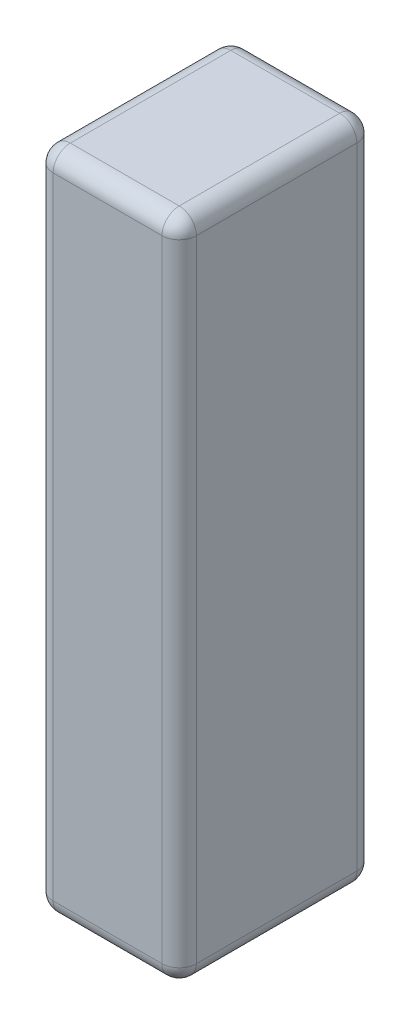
ISO-10303-21;
HEADER;
FILE_DESCRIPTION(('STEP AP214'),'2;1');
FILE_NAME('part.step','',(''),(''),'','','');
FILE_SCHEMA(('AUTOMOTIVE_DESIGN { 1 0 10303 214 1 1 1 1 }'));
ENDSEC;
DATA;
#1=APPLICATION_CONTEXT('core data for automotive mechanical design processes');
#2=APPLICATION_PROTOCOL_DEFINITION('international standard','automotive_design',2000,#1);
#3=PRODUCT_CONTEXT('',#1,'mechanical');
#4=PRODUCT('Part','Part','',(#3));
#5=PRODUCT_RELATED_PRODUCT_CATEGORY('part','',(#4));
#6=PRODUCT_DEFINITION_FORMATION('','',#4);
#7=PRODUCT_DEFINITION_CONTEXT('part definition',#1,'design');
#8=PRODUCT_DEFINITION('design','',#6,#7);
#9=PRODUCT_DEFINITION_SHAPE('','',#8);
#10=(LENGTH_UNIT() NAMED_UNIT(*) SI_UNIT(.MILLI.,.METRE.));
#11=(NAMED_UNIT(*) PLANE_ANGLE_UNIT() SI_UNIT($,.RADIAN.));
#12=(NAMED_UNIT(*) SI_UNIT($,.STERADIAN.) SOLID_ANGLE_UNIT());
#13=UNCERTAINTY_MEASURE_WITH_UNIT(LENGTH_MEASURE(1.E-05),#10,'distance_accuracy_value','');
#14=(GEOMETRIC_REPRESENTATION_CONTEXT(3) GLOBAL_UNCERTAINTY_ASSIGNED_CONTEXT((#13)) GLOBAL_UNIT_ASSIGNED_CONTEXT((#10,
#11,#12)) REPRESENTATION_CONTEXT('',''));
#15=CARTESIAN_POINT('',(0.,0.,0.));
#16=DIRECTION('',(0.,0.,1.));
#17=DIRECTION('',(1.,0.,0.));
#18=AXIS2_PLACEMENT_3D('',#15,#16,#17);
#19=CARTESIAN_POINT('',(-12.5,116.,-17.));
#20=DIRECTION('',(1.,0.,0.));
#21=DIRECTION('',(0.,0.,-1.));
#22=AXIS2_PLACEMENT_3D('',#19,#20,#21);
#23=PLANE('',#22);
#24=DIRECTION('',(0.,-1.,0.));
#25=VECTOR('',#24,1.);
#26=CARTESIAN_POINT('',(-12.5,116.,-14.));
#27=LINE('',#26,#25);
#28=CARTESIAN_POINT('',(-12.5,113.,-14.));
#29=VERTEX_POINT('',#28);
#30=CARTESIAN_POINT('',(-12.5,3.,-14.));
#31=VERTEX_POINT('',#30);
#32=EDGE_CURVE('E132',#29,#31,#27,.T.);
#33=ORIENTED_EDGE('',*,*,#32,.T.);
#34=DIRECTION('',(0.,0.,1.));
#35=VECTOR('',#34,1.);
#36=CARTESIAN_POINT('',(-12.5,3.,17.));
#37=LINE('',#36,#35);
#38=CARTESIAN_POINT('',(-12.5,3.,14.));
#39=VERTEX_POINT('',#38);
#40=EDGE_CURVE('E128',#31,#39,#37,.T.);
#41=ORIENTED_EDGE('',*,*,#40,.T.);
#42=DIRECTION('',(0.,-1.,0.));
#43=VECTOR('',#42,1.);
#44=CARTESIAN_POINT('',(-12.5,116.,14.));
#45=LINE('',#44,#43);
#46=CARTESIAN_POINT('',(-12.5,113.,14.));
#47=VERTEX_POINT('',#46);
#48=EDGE_CURVE('E121',#39,#47,#45,.F.);
#49=ORIENTED_EDGE('',*,*,#48,.T.);
#50=DIRECTION('',(0.,0.,1.));
#51=VECTOR('',#50,1.);
#52=CARTESIAN_POINT('',(-12.5,113.,-17.));
#53=LINE('',#52,#51);
#54=EDGE_CURVE('E125',#47,#29,#53,.F.);
#55=ORIENTED_EDGE('',*,*,#54,.T.);
#56=EDGE_LOOP('',(#33,#41,#49,#55));
#57=FACE_BOUND('',#56,.T.);
#58=ADVANCED_FACE('F33',(#57),#23,.F.);
#59=CARTESIAN_POINT('',(12.5,116.,17.));
#60=DIRECTION('',(0.,0.,-1.));
#61=DIRECTION('',(-1.,0.,0.));
#62=AXIS2_PLACEMENT_3D('',#59,#60,#61);
#63=PLANE('',#62);
#64=DIRECTION('',(0.,-1.,0.));
#65=VECTOR('',#64,1.);
#66=CARTESIAN_POINT('',(-9.5,116.,17.));
#67=LINE('',#66,#65);
#68=CARTESIAN_POINT('',(-9.5,113.,17.));
#69=VERTEX_POINT('',#68);
#70=CARTESIAN_POINT('',(-9.5,3.,17.));
#71=VERTEX_POINT('',#70);
#72=EDGE_CURVE('E140',#69,#71,#67,.T.);
#73=ORIENTED_EDGE('',*,*,#72,.T.);
#74=DIRECTION('',(1.,0.,0.));
#75=VECTOR('',#74,1.);
#76=CARTESIAN_POINT('',(12.5,3.,17.));
#77=LINE('',#76,#75);
#78=CARTESIAN_POINT('',(9.5,3.,17.));
#79=VERTEX_POINT('',#78);
#80=EDGE_CURVE('E178',#71,#79,#77,.T.);
#81=ORIENTED_EDGE('',*,*,#80,.T.);
#82=DIRECTION('',(0.,-1.,0.));
#83=VECTOR('',#82,1.);
#84=CARTESIAN_POINT('',(9.5,116.,17.));
#85=LINE('',#84,#83);
#86=CARTESIAN_POINT('',(9.5,113.,17.));
#87=VERTEX_POINT('',#86);
#88=EDGE_CURVE('E175',#79,#87,#85,.F.);
#89=ORIENTED_EDGE('',*,*,#88,.T.);
#90=DIRECTION('',(1.,0.,0.));
#91=VECTOR('',#90,1.);
#92=CARTESIAN_POINT('',(12.5,113.,17.));
#93=LINE('',#92,#91);
#94=EDGE_CURVE('E173',#87,#69,#93,.F.);
#95=ORIENTED_EDGE('',*,*,#94,.T.);
#96=EDGE_LOOP('',(#73,#81,#89,#95));
#97=FACE_BOUND('',#96,.T.);
#98=ADVANCED_FACE('F295',(#97),#63,.F.);
#99=CARTESIAN_POINT('',(12.5,116.,-17.));
#100=DIRECTION('',(-1.,0.,0.));
#101=DIRECTION('',(0.,0.,1.));
#102=AXIS2_PLACEMENT_3D('',#99,#100,#101);
#103=PLANE('',#102);
#104=DIRECTION('',(0.,-1.,0.));
#105=VECTOR('',#104,1.);
#106=CARTESIAN_POINT('',(12.5,116.,14.));
#107=LINE('',#106,#105);
#108=CARTESIAN_POINT('',(12.5,113.,14.));
#109=VERTEX_POINT('',#108);
#110=CARTESIAN_POINT('',(12.5,3.,14.));
#111=VERTEX_POINT('',#110);
#112=EDGE_CURVE('E184',#109,#111,#107,.T.);
#113=ORIENTED_EDGE('',*,*,#112,.T.);
#114=DIRECTION('',(0.,0.,-1.));
#115=VECTOR('',#114,1.);
#116=CARTESIAN_POINT('',(12.5,3.,-17.));
#117=LINE('',#116,#115);
#118=CARTESIAN_POINT('',(12.5,3.,-14.));
#119=VERTEX_POINT('',#118);
#120=EDGE_CURVE('E187',#111,#119,#117,.T.);
#121=ORIENTED_EDGE('',*,*,#120,.T.);
#122=DIRECTION('',(0.,-1.,0.));
#123=VECTOR('',#122,1.);
#124=CARTESIAN_POINT('',(12.5,116.,-14.));
#125=LINE('',#124,#123);
#126=CARTESIAN_POINT('',(12.5,113.,-14.));
#127=VERTEX_POINT('',#126);
#128=EDGE_CURVE('E182',#119,#127,#125,.F.);
#129=ORIENTED_EDGE('',*,*,#128,.T.);
#130=DIRECTION('',(0.,0.,-1.));
#131=VECTOR('',#130,1.);
#132=CARTESIAN_POINT('',(12.5,113.,-17.));
#133=LINE('',#132,#131);
#134=EDGE_CURVE('E180',#127,#109,#133,.F.);
#135=ORIENTED_EDGE('',*,*,#134,.T.);
#136=EDGE_LOOP('',(#113,#121,#129,#135));
#137=FACE_BOUND('',#136,.T.);
#138=ADVANCED_FACE('F272',(#137),#103,.F.);
#139=CARTESIAN_POINT('',(12.5,116.,-17.));
#140=DIRECTION('',(0.,0.,1.));
#141=DIRECTION('',(1.,0.,0.));
#142=AXIS2_PLACEMENT_3D('',#139,#140,#141);
#143=PLANE('',#142);
#144=DIRECTION('',(0.,-1.,0.));
#145=VECTOR('',#144,1.);
#146=CARTESIAN_POINT('',(9.5,116.,-17.));
#147=LINE('',#146,#145);
#148=CARTESIAN_POINT('',(9.5,113.,-17.));
#149=VERTEX_POINT('',#148);
#150=CARTESIAN_POINT('',(9.5,3.,-17.));
#151=VERTEX_POINT('',#150);
#152=EDGE_CURVE('E166',#149,#151,#147,.T.);
#153=ORIENTED_EDGE('',*,*,#152,.T.);
#154=DIRECTION('',(-1.,0.,0.));
#155=VECTOR('',#154,1.);
#156=CARTESIAN_POINT('',(-12.5,3.,-17.));
#157=LINE('',#156,#155);
#158=CARTESIAN_POINT('',(-9.5,3.,-17.));
#159=VERTEX_POINT('',#158);
#160=EDGE_CURVE('E171',#151,#159,#157,.T.);
#161=ORIENTED_EDGE('',*,*,#160,.T.);
#162=DIRECTION('',(0.,-1.,0.));
#163=VECTOR('',#162,1.);
#164=CARTESIAN_POINT('',(-9.5,116.,-17.));
#165=LINE('',#164,#163);
#166=CARTESIAN_POINT('',(-9.5,113.,-17.));
#167=VERTEX_POINT('',#166);
#168=EDGE_CURVE('E168',#159,#167,#165,.F.);
#169=ORIENTED_EDGE('',*,*,#168,.T.);
#170=DIRECTION('',(-1.,0.,0.));
#171=VECTOR('',#170,1.);
#172=CARTESIAN_POINT('',(12.5,113.,-17.));
#173=LINE('',#172,#171);
#174=EDGE_CURVE('E164',#167,#149,#173,.F.);
#175=ORIENTED_EDGE('',*,*,#174,.T.);
#176=EDGE_LOOP('',(#153,#161,#169,#175));
#177=FACE_BOUND('',#176,.T.);
#178=ADVANCED_FACE('F302',(#177),#143,.F.);
#179=CARTESIAN_POINT('',(0.,116.,0.));
#180=DIRECTION('',(0.,-1.,0.));
#181=DIRECTION('',(0.,0.,-1.));
#182=AXIS2_PLACEMENT_3D('',#179,#180,#181);
#183=PLANE('',#182);
#184=DIRECTION('',(0.,0.,-1.));
#185=VECTOR('',#184,1.);
#186=CARTESIAN_POINT('',(9.5,116.,0.));
#187=LINE('',#186,#185);
#188=CARTESIAN_POINT('',(9.5,116.,14.));
#189=VERTEX_POINT('',#188);
#190=CARTESIAN_POINT('',(9.5,116.,-14.));
#191=VERTEX_POINT('',#190);
#192=EDGE_CURVE('E42',#189,#191,#187,.T.);
#193=ORIENTED_EDGE('',*,*,#192,.T.);
#194=DIRECTION('',(-1.,0.,0.));
#195=VECTOR('',#194,1.);
#196=CARTESIAN_POINT('',(0.,116.,-14.));
#197=LINE('',#196,#195);
#198=CARTESIAN_POINT('',(-9.5,116.,-14.));
#199=VERTEX_POINT('',#198);
#200=EDGE_CURVE('E11',#191,#199,#197,.T.);
#201=ORIENTED_EDGE('',*,*,#200,.T.);
#202=DIRECTION('',(0.,0.,1.));
#203=VECTOR('',#202,1.);
#204=CARTESIAN_POINT('',(-9.5,116.,0.));
#205=LINE('',#204,#203);
#206=CARTESIAN_POINT('',(-9.5,116.,14.));
#207=VERTEX_POINT('',#206);
#208=EDGE_CURVE('E198',#199,#207,#205,.T.);
#209=ORIENTED_EDGE('',*,*,#208,.T.);
#210=DIRECTION('',(1.,0.,0.));
#211=VECTOR('',#210,1.);
#212=CARTESIAN_POINT('',(0.,116.,14.));
#213=LINE('',#212,#211);
#214=EDGE_CURVE('E53',#207,#189,#213,.T.);
#215=ORIENTED_EDGE('',*,*,#214,.T.);
#216=EDGE_LOOP('',(#193,#201,#209,#215));
#217=FACE_BOUND('',#216,.T.);
#218=ADVANCED_FACE('F365',(#217),#183,.F.);
#219=CARTESIAN_POINT('',(0.,0.,0.));
#220=DIRECTION('',(0.,-1.,0.));
#221=DIRECTION('',(0.,0.,-1.));
#222=AXIS2_PLACEMENT_3D('',#219,#220,#221);
#223=PLANE('',#222);
#224=DIRECTION('',(0.,0.,-1.));
#225=VECTOR('',#224,1.);
#226=CARTESIAN_POINT('',(9.5,0.,17.));
#227=LINE('',#226,#225);
#228=CARTESIAN_POINT('',(9.5,0.,-14.));
#229=VERTEX_POINT('',#228);
#230=CARTESIAN_POINT('',(9.5,0.,14.));
#231=VERTEX_POINT('',#230);
#232=EDGE_CURVE('E193',#229,#231,#227,.F.);
#233=ORIENTED_EDGE('',*,*,#232,.T.);
#234=DIRECTION('',(1.,0.,0.));
#235=VECTOR('',#234,1.);
#236=CARTESIAN_POINT('',(-12.5,0.,14.));
#237=LINE('',#236,#235);
#238=CARTESIAN_POINT('',(-9.5,0.,14.));
#239=VERTEX_POINT('',#238);
#240=EDGE_CURVE('E195',#231,#239,#237,.F.);
#241=ORIENTED_EDGE('',*,*,#240,.T.);
#242=DIRECTION('',(0.,0.,1.));
#243=VECTOR('',#242,1.);
#244=CARTESIAN_POINT('',(-9.5,0.,-17.));
#245=LINE('',#244,#243);
#246=CARTESIAN_POINT('',(-9.5,0.,-14.));
#247=VERTEX_POINT('',#246);
#248=EDGE_CURVE('E189',#239,#247,#245,.F.);
#249=ORIENTED_EDGE('',*,*,#248,.T.);
#250=DIRECTION('',(-1.,0.,0.));
#251=VECTOR('',#250,1.);
#252=CARTESIAN_POINT('',(12.5,0.,-14.));
#253=LINE('',#252,#251);
#254=EDGE_CURVE('E191',#247,#229,#253,.F.);
#255=ORIENTED_EDGE('',*,*,#254,.T.);
#256=EDGE_LOOP('',(#233,#241,#249,#255));
#257=FACE_BOUND('',#256,.T.);
#258=ADVANCED_FACE('F264',(#257),#223,.T.);
#259=CARTESIAN_POINT('',(9.5,116.,14.));
#260=DIRECTION('',(0.,-1.,0.));
#261=DIRECTION('',(0.,0.,-1.));
#262=AXIS2_PLACEMENT_3D('',#259,#260,#261);
#263=CYLINDRICAL_SURFACE('',#262,3.);
#264=CARTESIAN_POINT('',(9.5,113.,14.));
#265=DIRECTION('',(0.,1.,0.));
#266=DIRECTION('',(0.,0.,1.));
#267=AXIS2_PLACEMENT_3D('',#264,#265,#266);
#268=CIRCLE('',#267,3.);
#269=EDGE_CURVE('E37',#87,#109,#268,.T.);
#270=ORIENTED_EDGE('',*,*,#269,.F.);
#271=ORIENTED_EDGE('',*,*,#88,.F.);
#272=CARTESIAN_POINT('',(9.5,3.,14.));
#273=DIRECTION('',(0.,-1.,0.));
#274=DIRECTION('',(0.,0.,-1.));
#275=AXIS2_PLACEMENT_3D('',#272,#273,#274);
#276=CIRCLE('',#275,3.);
#277=EDGE_CURVE('E160',#111,#79,#276,.T.);
#278=ORIENTED_EDGE('',*,*,#277,.F.);
#279=ORIENTED_EDGE('',*,*,#112,.F.);
#280=EDGE_LOOP('',(#270,#271,#278,#279));
#281=FACE_BOUND('',#280,.T.);
#282=ADVANCED_FACE('F35',(#281),#263,.T.);
#283=CARTESIAN_POINT('',(9.5,113.,14.));
#284=DIRECTION('',(0.,0.,1.));
#285=DIRECTION('',(1.,0.,0.));
#286=AXIS2_PLACEMENT_3D('',#283,#284,#285);
#287=SPHERICAL_SURFACE('',#286,3.);
#288=CARTESIAN_POINT('',(9.5,113.,14.));
#289=DIRECTION('',(1.,0.,0.));
#290=DIRECTION('',(0.,0.,-1.));
#291=AXIS2_PLACEMENT_3D('',#288,#289,#290);
#292=CIRCLE('',#291,3.);
#293=EDGE_CURVE('E245',#87,#189,#292,.F.);
#294=ORIENTED_EDGE('',*,*,#293,.F.);
#295=ORIENTED_EDGE('',*,*,#269,.T.);
#296=CARTESIAN_POINT('',(9.5,113.,14.));
#297=DIRECTION('',(0.,0.,1.));
#298=DIRECTION('',(1.,0.,0.));
#299=AXIS2_PLACEMENT_3D('',#296,#297,#298);
#300=CIRCLE('',#299,3.);
#301=EDGE_CURVE('E247',#189,#109,#300,.F.);
#302=ORIENTED_EDGE('',*,*,#301,.F.);
#303=EDGE_LOOP('',(#294,#295,#302));
#304=FACE_BOUND('',#303,.T.);
#305=ADVANCED_FACE('F290',(#304),#287,.T.);
#306=CARTESIAN_POINT('',(9.5,3.,14.));
#307=DIRECTION('',(0.,0.,1.));
#308=DIRECTION('',(1.,0.,0.));
#309=AXIS2_PLACEMENT_3D('',#306,#307,#308);
#310=SPHERICAL_SURFACE('',#309,3.);
#311=CARTESIAN_POINT('',(9.5,3.,14.));
#312=DIRECTION('',(0.,0.,1.));
#313=DIRECTION('',(1.,0.,0.));
#314=AXIS2_PLACEMENT_3D('',#311,#312,#313);
#315=CIRCLE('',#314,3.);
#316=EDGE_CURVE('E239',#111,#231,#315,.F.);
#317=ORIENTED_EDGE('',*,*,#316,.F.);
#318=ORIENTED_EDGE('',*,*,#277,.T.);
#319=CARTESIAN_POINT('',(9.5,3.,14.));
#320=DIRECTION('',(1.,0.,0.));
#321=DIRECTION('',(0.,0.,-1.));
#322=AXIS2_PLACEMENT_3D('',#319,#320,#321);
#323=CIRCLE('',#322,3.);
#324=EDGE_CURVE('E242',#231,#79,#323,.F.);
#325=ORIENTED_EDGE('',*,*,#324,.F.);
#326=EDGE_LOOP('',(#317,#318,#325));
#327=FACE_BOUND('',#326,.T.);
#328=ADVANCED_FACE('F254',(#327),#310,.T.);
#329=CARTESIAN_POINT('',(9.5,113.,0.));
#330=DIRECTION('',(0.,0.,-1.));
#331=DIRECTION('',(-1.,0.,0.));
#332=AXIS2_PLACEMENT_3D('',#329,#330,#331);
#333=CYLINDRICAL_SURFACE('',#332,3.);
#334=ORIENTED_EDGE('',*,*,#301,.T.);
#335=ORIENTED_EDGE('',*,*,#134,.F.);
#336=CARTESIAN_POINT('',(9.5,113.,-14.));
#337=DIRECTION('',(0.,0.,-1.));
#338=DIRECTION('',(-1.,0.,0.));
#339=AXIS2_PLACEMENT_3D('',#336,#337,#338);
#340=CIRCLE('',#339,3.);
#341=EDGE_CURVE('E233',#191,#127,#340,.T.);
#342=ORIENTED_EDGE('',*,*,#341,.F.);
#343=ORIENTED_EDGE('',*,*,#192,.F.);
#344=EDGE_LOOP('',(#334,#335,#342,#343));
#345=FACE_BOUND('',#344,.T.);
#346=ADVANCED_FACE('F285',(#345),#333,.T.);
#347=CARTESIAN_POINT('',(0.,113.,14.));
#348=DIRECTION('',(1.,0.,0.));
#349=DIRECTION('',(0.,0.,-1.));
#350=AXIS2_PLACEMENT_3D('',#347,#348,#349);
#351=CYLINDRICAL_SURFACE('',#350,3.);
#352=ORIENTED_EDGE('',*,*,#293,.T.);
#353=ORIENTED_EDGE('',*,*,#214,.F.);
#354=CARTESIAN_POINT('',(-9.5,113.,14.));
#355=DIRECTION('',(-1.,0.,0.));
#356=DIRECTION('',(0.,-1.,0.));
#357=AXIS2_PLACEMENT_3D('',#354,#355,#356);
#358=CIRCLE('',#357,3.);
#359=EDGE_CURVE('E144',#69,#207,#358,.T.);
#360=ORIENTED_EDGE('',*,*,#359,.F.);
#361=ORIENTED_EDGE('',*,*,#94,.F.);
#362=EDGE_LOOP('',(#352,#353,#360,#361));
#363=FACE_BOUND('',#362,.T.);
#364=ADVANCED_FACE('F293',(#363),#351,.T.);
#365=CARTESIAN_POINT('',(-9.5,116.,14.));
#366=DIRECTION('',(0.,-1.,0.));
#367=DIRECTION('',(0.,0.,-1.));
#368=AXIS2_PLACEMENT_3D('',#365,#366,#367);
#369=CYLINDRICAL_SURFACE('',#368,3.);
#370=CARTESIAN_POINT('',(-9.5,3.,14.));
#371=DIRECTION('',(0.,-1.,0.));
#372=DIRECTION('',(0.,0.,-1.));
#373=AXIS2_PLACEMENT_3D('',#370,#371,#372);
#374=CIRCLE('',#373,3.);
#375=EDGE_CURVE('E145',#71,#39,#374,.T.);
#376=ORIENTED_EDGE('',*,*,#375,.F.);
#377=ORIENTED_EDGE('',*,*,#72,.F.);
#378=CARTESIAN_POINT('',(-9.5,113.,14.));
#379=DIRECTION('',(0.,1.,0.));
#380=DIRECTION('',(0.,0.,1.));
#381=AXIS2_PLACEMENT_3D('',#378,#379,#380);
#382=CIRCLE('',#381,3.);
#383=EDGE_CURVE('E136',#47,#69,#382,.T.);
#384=ORIENTED_EDGE('',*,*,#383,.F.);
#385=ORIENTED_EDGE('',*,*,#48,.F.);
#386=EDGE_LOOP('',(#376,#377,#384,#385));
#387=FACE_BOUND('',#386,.T.);
#388=ADVANCED_FACE('F138',(#387),#369,.T.);
#389=CARTESIAN_POINT('',(12.5,3.,14.));
#390=DIRECTION('',(-1.,0.,0.));
#391=DIRECTION('',(0.,0.,1.));
#392=AXIS2_PLACEMENT_3D('',#389,#390,#391);
#393=CYLINDRICAL_SURFACE('',#392,3.);
#394=ORIENTED_EDGE('',*,*,#324,.T.);
#395=ORIENTED_EDGE('',*,*,#80,.F.);
#396=CARTESIAN_POINT('',(-9.5,3.,14.));
#397=DIRECTION('',(-1.,0.,0.));
#398=DIRECTION('',(0.,0.,1.));
#399=AXIS2_PLACEMENT_3D('',#396,#397,#398);
#400=CIRCLE('',#399,3.);
#401=EDGE_CURVE('E229',#239,#71,#400,.T.);
#402=ORIENTED_EDGE('',*,*,#401,.F.);
#403=ORIENTED_EDGE('',*,*,#240,.F.);
#404=EDGE_LOOP('',(#394,#395,#402,#403));
#405=FACE_BOUND('',#404,.T.);
#406=ADVANCED_FACE('F261',(#405),#393,.T.);
#407=CARTESIAN_POINT('',(9.5,3.,-17.));
#408=DIRECTION('',(0.,0.,1.));
#409=DIRECTION('',(1.,0.,0.));
#410=AXIS2_PLACEMENT_3D('',#407,#408,#409);
#411=CYLINDRICAL_SURFACE('',#410,3.);
#412=ORIENTED_EDGE('',*,*,#316,.T.);
#413=ORIENTED_EDGE('',*,*,#232,.F.);
#414=CARTESIAN_POINT('',(9.5,3.,-14.));
#415=DIRECTION('',(0.,0.,-1.));
#416=DIRECTION('',(-1.,0.,0.));
#417=AXIS2_PLACEMENT_3D('',#414,#415,#416);
#418=CIRCLE('',#417,3.);
#419=EDGE_CURVE('E226',#119,#229,#418,.T.);
#420=ORIENTED_EDGE('',*,*,#419,.F.);
#421=ORIENTED_EDGE('',*,*,#120,.F.);
#422=EDGE_LOOP('',(#412,#413,#420,#421));
#423=FACE_BOUND('',#422,.T.);
#424=ADVANCED_FACE('F269',(#423),#411,.T.);
#425=CARTESIAN_POINT('',(9.5,116.,-14.));
#426=DIRECTION('',(0.,-1.,0.));
#427=DIRECTION('',(0.,0.,-1.));
#428=AXIS2_PLACEMENT_3D('',#425,#426,#427);
#429=CYLINDRICAL_SURFACE('',#428,3.);
#430=CARTESIAN_POINT('',(9.5,113.,-14.));
#431=DIRECTION('',(0.,1.,0.));
#432=DIRECTION('',(0.,0.,1.));
#433=AXIS2_PLACEMENT_3D('',#430,#431,#432);
#434=CIRCLE('',#433,3.);
#435=EDGE_CURVE('E236',#127,#149,#434,.T.);
#436=ORIENTED_EDGE('',*,*,#435,.F.);
#437=ORIENTED_EDGE('',*,*,#128,.F.);
#438=CARTESIAN_POINT('',(9.5,3.,-14.));
#439=DIRECTION('',(0.,-1.,0.));
#440=DIRECTION('',(0.,0.,-1.));
#441=AXIS2_PLACEMENT_3D('',#438,#439,#440);
#442=CIRCLE('',#441,3.);
#443=EDGE_CURVE('E223',#151,#119,#442,.T.);
#444=ORIENTED_EDGE('',*,*,#443,.F.);
#445=ORIENTED_EDGE('',*,*,#152,.F.);
#446=EDGE_LOOP('',(#436,#437,#444,#445));
#447=FACE_BOUND('',#446,.T.);
#448=ADVANCED_FACE('F277',(#447),#429,.T.);
#449=CARTESIAN_POINT('',(9.5,113.,-14.));
#450=DIRECTION('',(0.,0.,1.));
#451=DIRECTION('',(1.,0.,0.));
#452=AXIS2_PLACEMENT_3D('',#449,#450,#451);
#453=SPHERICAL_SURFACE('',#452,3.);
#454=ORIENTED_EDGE('',*,*,#341,.T.);
#455=ORIENTED_EDGE('',*,*,#435,.T.);
#456=CARTESIAN_POINT('',(9.5,113.,-14.));
#457=DIRECTION('',(1.,0.,0.));
#458=DIRECTION('',(0.,0.,-1.));
#459=AXIS2_PLACEMENT_3D('',#456,#457,#458);
#460=CIRCLE('',#459,3.);
#461=EDGE_CURVE('E152',#191,#149,#460,.F.);
#462=ORIENTED_EDGE('',*,*,#461,.F.);
#463=EDGE_LOOP('',(#454,#455,#462));
#464=FACE_BOUND('',#463,.T.);
#465=ADVANCED_FACE('F282',(#464),#453,.T.);
#466=CARTESIAN_POINT('',(-9.5,113.,14.));
#467=DIRECTION('',(0.,0.,1.));
#468=DIRECTION('',(1.,0.,0.));
#469=AXIS2_PLACEMENT_3D('',#466,#467,#468);
#470=SPHERICAL_SURFACE('',#469,3.);
#471=ORIENTED_EDGE('',*,*,#383,.T.);
#472=ORIENTED_EDGE('',*,*,#359,.T.);
#473=CARTESIAN_POINT('',(-9.5,113.,14.));
#474=DIRECTION('',(0.,0.,1.));
#475=DIRECTION('',(1.,0.,0.));
#476=AXIS2_PLACEMENT_3D('',#473,#474,#475);
#477=CIRCLE('',#476,3.);
#478=EDGE_CURVE('E148',#47,#207,#477,.F.);
#479=ORIENTED_EDGE('',*,*,#478,.F.);
#480=EDGE_LOOP('',(#471,#472,#479));
#481=FACE_BOUND('',#480,.T.);
#482=ADVANCED_FACE('F149',(#481),#470,.T.);
#483=CARTESIAN_POINT('',(-9.5,3.,14.));
#484=DIRECTION('',(0.,0.,1.));
#485=DIRECTION('',(1.,0.,0.));
#486=AXIS2_PLACEMENT_3D('',#483,#484,#485);
#487=SPHERICAL_SURFACE('',#486,3.);
#488=ORIENTED_EDGE('',*,*,#401,.T.);
#489=ORIENTED_EDGE('',*,*,#375,.T.);
#490=CARTESIAN_POINT('',(-9.5,3.,14.));
#491=DIRECTION('',(0.,0.,1.));
#492=DIRECTION('',(1.,0.,0.));
#493=AXIS2_PLACEMENT_3D('',#490,#491,#492);
#494=CIRCLE('',#493,3.);
#495=EDGE_CURVE('E153',#239,#39,#494,.F.);
#496=ORIENTED_EDGE('',*,*,#495,.F.);
#497=EDGE_LOOP('',(#488,#489,#496));
#498=FACE_BOUND('',#497,.T.);
#499=ADVANCED_FACE('F336',(#498),#487,.T.);
#500=CARTESIAN_POINT('',(9.5,3.,-14.));
#501=DIRECTION('',(0.,0.,1.));
#502=DIRECTION('',(1.,0.,0.));
#503=AXIS2_PLACEMENT_3D('',#500,#501,#502);
#504=SPHERICAL_SURFACE('',#503,3.);
#505=ORIENTED_EDGE('',*,*,#443,.T.);
#506=ORIENTED_EDGE('',*,*,#419,.T.);
#507=CARTESIAN_POINT('',(9.5,3.,-14.));
#508=DIRECTION('',(1.,0.,0.));
#509=DIRECTION('',(0.,0.,-1.));
#510=AXIS2_PLACEMENT_3D('',#507,#508,#509);
#511=CIRCLE('',#510,3.);
#512=EDGE_CURVE('E216',#151,#229,#511,.F.);
#513=ORIENTED_EDGE('',*,*,#512,.F.);
#514=EDGE_LOOP('',(#505,#506,#513));
#515=FACE_BOUND('',#514,.T.);
#516=ADVANCED_FACE('F332',(#515),#504,.T.);
#517=CARTESIAN_POINT('',(0.,113.,-14.));
#518=DIRECTION('',(-1.,0.,0.));
#519=DIRECTION('',(0.,0.,1.));
#520=AXIS2_PLACEMENT_3D('',#517,#518,#519);
#521=CYLINDRICAL_SURFACE('',#520,3.);
#522=ORIENTED_EDGE('',*,*,#461,.T.);
#523=ORIENTED_EDGE('',*,*,#174,.F.);
#524=CARTESIAN_POINT('',(-9.5,113.,-14.));
#525=DIRECTION('',(-1.,0.,0.));
#526=DIRECTION('',(0.,0.,1.));
#527=AXIS2_PLACEMENT_3D('',#524,#525,#526);
#528=CIRCLE('',#527,3.);
#529=EDGE_CURVE('E213',#199,#167,#528,.T.);
#530=ORIENTED_EDGE('',*,*,#529,.F.);
#531=ORIENTED_EDGE('',*,*,#200,.F.);
#532=EDGE_LOOP('',(#522,#523,#530,#531));
#533=FACE_BOUND('',#532,.T.);
#534=ADVANCED_FACE('F329',(#533),#521,.T.);
#535=CARTESIAN_POINT('',(-9.5,113.,0.));
#536=DIRECTION('',(0.,0.,1.));
#537=DIRECTION('',(1.,0.,0.));
#538=AXIS2_PLACEMENT_3D('',#535,#536,#537);
#539=CYLINDRICAL_SURFACE('',#538,3.);
#540=ORIENTED_EDGE('',*,*,#478,.T.);
#541=ORIENTED_EDGE('',*,*,#208,.F.);
#542=CARTESIAN_POINT('',(-9.5,113.,-14.));
#543=DIRECTION('',(0.,0.,-1.));
#544=DIRECTION('',(-1.,0.,0.));
#545=AXIS2_PLACEMENT_3D('',#542,#543,#544);
#546=CIRCLE('',#545,3.);
#547=EDGE_CURVE('E156',#29,#199,#546,.T.);
#548=ORIENTED_EDGE('',*,*,#547,.F.);
#549=ORIENTED_EDGE('',*,*,#54,.F.);
#550=EDGE_LOOP('',(#540,#541,#548,#549));
#551=FACE_BOUND('',#550,.T.);
#552=ADVANCED_FACE('F155',(#551),#539,.T.);
#553=CARTESIAN_POINT('',(-9.5,3.,-17.));
#554=DIRECTION('',(0.,0.,-1.));
#555=DIRECTION('',(-1.,0.,0.));
#556=AXIS2_PLACEMENT_3D('',#553,#554,#555);
#557=CYLINDRICAL_SURFACE('',#556,3.);
#558=ORIENTED_EDGE('',*,*,#495,.T.);
#559=ORIENTED_EDGE('',*,*,#40,.F.);
#560=CARTESIAN_POINT('',(-9.5,3.,-14.));
#561=DIRECTION('',(0.,0.,-1.));
#562=DIRECTION('',(-1.,0.,0.));
#563=AXIS2_PLACEMENT_3D('',#560,#561,#562);
#564=CIRCLE('',#563,3.);
#565=EDGE_CURVE('E209',#247,#31,#564,.T.);
#566=ORIENTED_EDGE('',*,*,#565,.F.);
#567=ORIENTED_EDGE('',*,*,#248,.F.);
#568=EDGE_LOOP('',(#558,#559,#566,#567));
#569=FACE_BOUND('',#568,.T.);
#570=ADVANCED_FACE('F322',(#569),#557,.T.);
#571=CARTESIAN_POINT('',(12.5,3.,-14.));
#572=DIRECTION('',(1.,0.,0.));
#573=DIRECTION('',(0.,0.,-1.));
#574=AXIS2_PLACEMENT_3D('',#571,#572,#573);
#575=CYLINDRICAL_SURFACE('',#574,3.);
#576=ORIENTED_EDGE('',*,*,#512,.T.);
#577=ORIENTED_EDGE('',*,*,#254,.F.);
#578=CARTESIAN_POINT('',(-9.5,3.,-14.));
#579=DIRECTION('',(-1.,0.,0.));
#580=DIRECTION('',(0.,0.,1.));
#581=AXIS2_PLACEMENT_3D('',#578,#579,#580);
#582=CIRCLE('',#581,3.);
#583=EDGE_CURVE('E206',#159,#247,#582,.T.);
#584=ORIENTED_EDGE('',*,*,#583,.F.);
#585=ORIENTED_EDGE('',*,*,#160,.F.);
#586=EDGE_LOOP('',(#576,#577,#584,#585));
#587=FACE_BOUND('',#586,.T.);
#588=ADVANCED_FACE('F318',(#587),#575,.T.);
#589=CARTESIAN_POINT('',(-9.5,113.,-14.));
#590=DIRECTION('',(0.,0.,1.));
#591=DIRECTION('',(1.,0.,0.));
#592=AXIS2_PLACEMENT_3D('',#589,#590,#591);
#593=SPHERICAL_SURFACE('',#592,3.);
#594=ORIENTED_EDGE('',*,*,#547,.T.);
#595=ORIENTED_EDGE('',*,*,#529,.T.);
#596=CARTESIAN_POINT('',(-9.5,113.,-14.));
#597=DIRECTION('',(0.,1.,0.));
#598=DIRECTION('',(0.,0.,1.));
#599=AXIS2_PLACEMENT_3D('',#596,#597,#598);
#600=CIRCLE('',#599,3.);
#601=EDGE_CURVE('E204',#29,#167,#600,.F.);
#602=ORIENTED_EDGE('',*,*,#601,.F.);
#603=EDGE_LOOP('',(#594,#595,#602));
#604=FACE_BOUND('',#603,.T.);
#605=ADVANCED_FACE('F314',(#604),#593,.T.);
#606=CARTESIAN_POINT('',(-9.5,3.,-14.));
#607=DIRECTION('',(0.,0.,1.));
#608=DIRECTION('',(1.,0.,0.));
#609=AXIS2_PLACEMENT_3D('',#606,#607,#608);
#610=SPHERICAL_SURFACE('',#609,3.);
#611=ORIENTED_EDGE('',*,*,#583,.T.);
#612=ORIENTED_EDGE('',*,*,#565,.T.);
#613=CARTESIAN_POINT('',(-9.5,3.,-14.));
#614=DIRECTION('',(0.,-1.,0.));
#615=DIRECTION('',(0.,0.,-1.));
#616=AXIS2_PLACEMENT_3D('',#613,#614,#615);
#617=CIRCLE('',#616,3.);
#618=EDGE_CURVE('E202',#159,#31,#617,.F.);
#619=ORIENTED_EDGE('',*,*,#618,.F.);
#620=EDGE_LOOP('',(#611,#612,#619));
#621=FACE_BOUND('',#620,.T.);
#622=ADVANCED_FACE('F310',(#621),#610,.T.);
#623=CARTESIAN_POINT('',(-9.5,116.,-14.));
#624=DIRECTION('',(0.,-1.,0.));
#625=DIRECTION('',(0.,0.,-1.));
#626=AXIS2_PLACEMENT_3D('',#623,#624,#625);
#627=CYLINDRICAL_SURFACE('',#626,3.);
#628=ORIENTED_EDGE('',*,*,#601,.T.);
#629=ORIENTED_EDGE('',*,*,#168,.F.);
#630=ORIENTED_EDGE('',*,*,#618,.T.);
#631=ORIENTED_EDGE('',*,*,#32,.F.);
#632=EDGE_LOOP('',(#628,#629,#630,#631));
#633=FACE_BOUND('',#632,.T.);
#634=ADVANCED_FACE('F307',(#633),#627,.T.);
#635=CLOSED_SHELL('',(#58,#98,#138,#178,#218,#258,#282,#305,#328,#346,#364,#388,#406,#424,#448,
#465,#482,#499,#516,#534,#552,#570,#588,#605,#622,#634));
#636=MANIFOLD_SOLID_BREP('B2',#635);
#637=ADVANCED_BREP_SHAPE_REPRESENTATION('',(#18,#636),#14);
#638=SHAPE_DEFINITION_REPRESENTATION(#9,#637);
ENDSEC;
END-ISO-10303-21;
